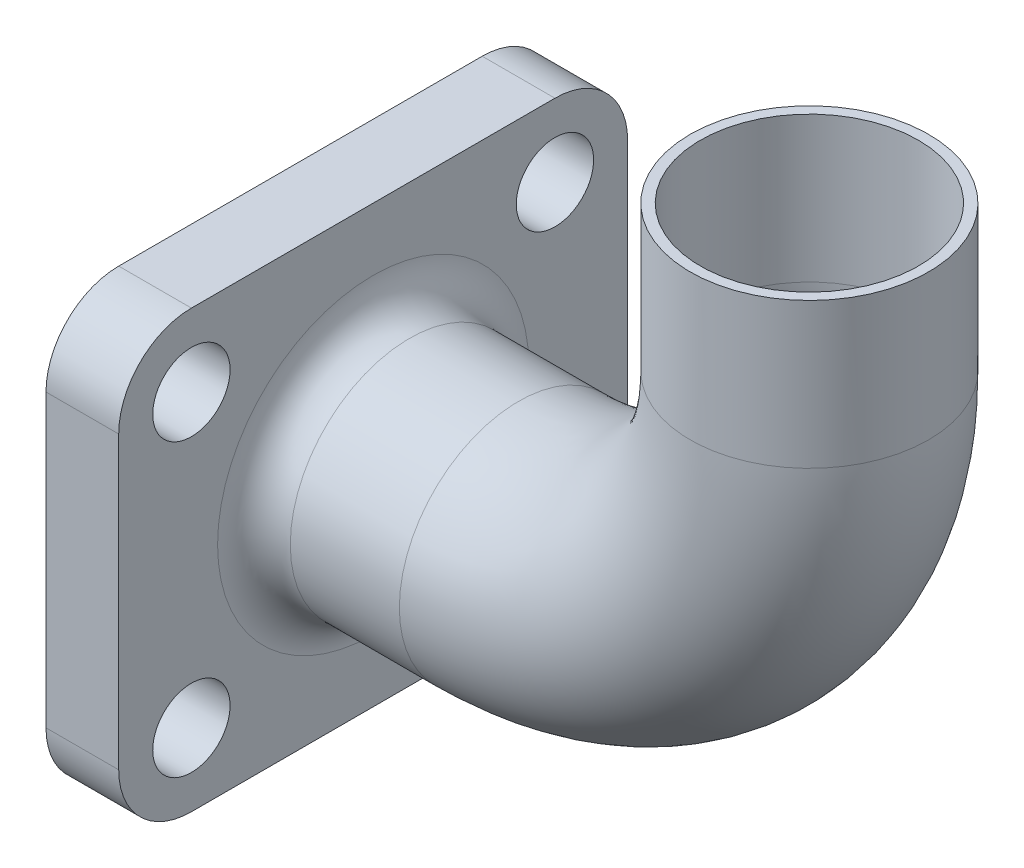
ISO-10303-21;
HEADER;
FILE_DESCRIPTION(('STEP AP214'),'2;1');
FILE_NAME('part.step','',(''),(''),'','','');
FILE_SCHEMA(('AUTOMOTIVE_DESIGN { 1 0 10303 214 1 1 1 1 }'));
ENDSEC;
DATA;
#1=APPLICATION_CONTEXT('core data for automotive mechanical design processes');
#2=APPLICATION_PROTOCOL_DEFINITION('international standard','automotive_design',2000,#1);
#3=PRODUCT_CONTEXT('',#1,'mechanical');
#4=PRODUCT('Part','Part','',(#3));
#5=PRODUCT_RELATED_PRODUCT_CATEGORY('part','',(#4));
#6=PRODUCT_DEFINITION_FORMATION('','',#4);
#7=PRODUCT_DEFINITION_CONTEXT('part definition',#1,'design');
#8=PRODUCT_DEFINITION('design','',#6,#7);
#9=PRODUCT_DEFINITION_SHAPE('','',#8);
#10=(LENGTH_UNIT() NAMED_UNIT(*) SI_UNIT(.MILLI.,.METRE.));
#11=(NAMED_UNIT(*) PLANE_ANGLE_UNIT() SI_UNIT($,.RADIAN.));
#12=(NAMED_UNIT(*) SI_UNIT($,.STERADIAN.) SOLID_ANGLE_UNIT());
#13=UNCERTAINTY_MEASURE_WITH_UNIT(LENGTH_MEASURE(1.E-05),#10,'distance_accuracy_value','');
#14=(GEOMETRIC_REPRESENTATION_CONTEXT(3) GLOBAL_UNCERTAINTY_ASSIGNED_CONTEXT((#13)) GLOBAL_UNIT_ASSIGNED_CONTEXT((#10,
#11,#12)) REPRESENTATION_CONTEXT('',''));
#15=CARTESIAN_POINT('',(0.,0.,0.));
#16=DIRECTION('',(0.,0.,1.));
#17=DIRECTION('',(1.,0.,0.));
#18=AXIS2_PLACEMENT_3D('',#15,#16,#17);
#19=CARTESIAN_POINT('',(6.35,-12.7,15.875));
#20=DIRECTION('',(-1.,0.,0.));
#21=DIRECTION('',(0.,0.,1.));
#22=AXIS2_PLACEMENT_3D('',#19,#20,#21);
#23=CYLINDRICAL_SURFACE('',#22,6.35);
#24=CARTESIAN_POINT('',(0.,-12.7,15.875));
#25=DIRECTION('',(1.,0.,0.));
#26=DIRECTION('',(0.,0.,1.));
#27=AXIS2_PLACEMENT_3D('',#24,#25,#26);
#28=CIRCLE('',#27,6.35);
#29=CARTESIAN_POINT('',(0.,-12.7,22.225));
#30=VERTEX_POINT('',#29);
#31=CARTESIAN_POINT('',(0.,-19.05,15.875));
#32=VERTEX_POINT('',#31);
#33=EDGE_CURVE('E135',#30,#32,#28,.T.);
#34=ORIENTED_EDGE('',*,*,#33,.T.);
#35=DIRECTION('',(-1.,0.,0.));
#36=VECTOR('',#35,1.);
#37=CARTESIAN_POINT('',(6.35,-19.05,15.875));
#38=LINE('',#37,#36);
#39=CARTESIAN_POINT('',(6.35,-19.05,15.875));
#40=VERTEX_POINT('',#39);
#41=EDGE_CURVE('E163',#40,#32,#38,.T.);
#42=ORIENTED_EDGE('',*,*,#41,.F.);
#43=CARTESIAN_POINT('',(6.35,-12.7,15.875));
#44=DIRECTION('',(1.,0.,0.));
#45=DIRECTION('',(0.,0.,1.));
#46=AXIS2_PLACEMENT_3D('',#43,#44,#45);
#47=CIRCLE('',#46,6.35);
#48=CARTESIAN_POINT('',(6.35,-12.7,22.225));
#49=VERTEX_POINT('',#48);
#50=EDGE_CURVE('E150',#49,#40,#47,.T.);
#51=ORIENTED_EDGE('',*,*,#50,.F.);
#52=DIRECTION('',(-1.,0.,0.));
#53=VECTOR('',#52,1.);
#54=CARTESIAN_POINT('',(6.35,-12.7,22.225));
#55=LINE('',#54,#53);
#56=EDGE_CURVE('E131',#49,#30,#55,.T.);
#57=ORIENTED_EDGE('',*,*,#56,.T.);
#58=EDGE_LOOP('',(#34,#42,#51,#57));
#59=FACE_BOUND('',#58,.T.);
#60=ADVANCED_FACE('F37',(#59),#23,.T.);
#61=CARTESIAN_POINT('',(6.35,-19.05,-15.875));
#62=DIRECTION('',(0.,1.,0.));
#63=DIRECTION('',(0.,0.,1.));
#64=AXIS2_PLACEMENT_3D('',#61,#62,#63);
#65=PLANE('',#64);
#66=DIRECTION('',(0.,0.,-1.));
#67=VECTOR('',#66,1.);
#68=CARTESIAN_POINT('',(0.,-19.05,-15.875));
#69=LINE('',#68,#67);
#70=CARTESIAN_POINT('',(0.,-19.05,-15.875));
#71=VERTEX_POINT('',#70);
#72=EDGE_CURVE('E138',#32,#71,#69,.T.);
#73=ORIENTED_EDGE('',*,*,#72,.T.);
#74=DIRECTION('',(-1.,0.,0.));
#75=VECTOR('',#74,1.);
#76=CARTESIAN_POINT('',(6.35,-19.05,-15.875));
#77=LINE('',#76,#75);
#78=CARTESIAN_POINT('',(6.35,-19.05,-15.875));
#79=VERTEX_POINT('',#78);
#80=EDGE_CURVE('E160',#79,#71,#77,.T.);
#81=ORIENTED_EDGE('',*,*,#80,.F.);
#82=DIRECTION('',(0.,0.,-1.));
#83=VECTOR('',#82,1.);
#84=CARTESIAN_POINT('',(6.35,-19.05,-15.875));
#85=LINE('',#84,#83);
#86=EDGE_CURVE('E98',#40,#79,#85,.T.);
#87=ORIENTED_EDGE('',*,*,#86,.F.);
#88=ORIENTED_EDGE('',*,*,#41,.T.);
#89=EDGE_LOOP('',(#73,#81,#87,#88));
#90=FACE_BOUND('',#89,.T.);
#91=ADVANCED_FACE('F223',(#90),#65,.F.);
#92=CARTESIAN_POINT('',(6.35,-12.7,-15.875));
#93=DIRECTION('',(-1.,0.,0.));
#94=DIRECTION('',(0.,0.,1.));
#95=AXIS2_PLACEMENT_3D('',#92,#93,#94);
#96=CYLINDRICAL_SURFACE('',#95,6.35);
#97=CARTESIAN_POINT('',(0.,-12.7,-15.875));
#98=DIRECTION('',(1.,0.,0.));
#99=DIRECTION('',(0.,0.,-1.));
#100=AXIS2_PLACEMENT_3D('',#97,#98,#99);
#101=CIRCLE('',#100,6.35);
#102=CARTESIAN_POINT('',(0.,-12.7,-22.225));
#103=VERTEX_POINT('',#102);
#104=EDGE_CURVE('E141',#71,#103,#101,.T.);
#105=ORIENTED_EDGE('',*,*,#104,.T.);
#106=DIRECTION('',(-1.,0.,0.));
#107=VECTOR('',#106,1.);
#108=CARTESIAN_POINT('',(6.35,-12.7,-22.225));
#109=LINE('',#108,#107);
#110=CARTESIAN_POINT('',(6.35,-12.7,-22.225));
#111=VERTEX_POINT('',#110);
#112=EDGE_CURVE('E157',#111,#103,#109,.T.);
#113=ORIENTED_EDGE('',*,*,#112,.F.);
#114=CARTESIAN_POINT('',(6.35,-12.7,-15.875));
#115=DIRECTION('',(1.,0.,0.));
#116=DIRECTION('',(0.,0.,-1.));
#117=AXIS2_PLACEMENT_3D('',#114,#115,#116);
#118=CIRCLE('',#117,6.35);
#119=EDGE_CURVE('E191',#79,#111,#118,.T.);
#120=ORIENTED_EDGE('',*,*,#119,.F.);
#121=ORIENTED_EDGE('',*,*,#80,.T.);
#122=EDGE_LOOP('',(#105,#113,#120,#121));
#123=FACE_BOUND('',#122,.T.);
#124=ADVANCED_FACE('F227',(#123),#96,.T.);
#125=CARTESIAN_POINT('',(6.35,-12.7,-22.225));
#126=DIRECTION('',(0.,0.,1.));
#127=DIRECTION('',(1.,0.,0.));
#128=AXIS2_PLACEMENT_3D('',#125,#126,#127);
#129=PLANE('',#128);
#130=DIRECTION('',(0.,1.,0.));
#131=VECTOR('',#130,1.);
#132=CARTESIAN_POINT('',(0.,-12.7,-22.225));
#133=LINE('',#132,#131);
#134=CARTESIAN_POINT('',(0.,12.7,-22.225));
#135=VERTEX_POINT('',#134);
#136=EDGE_CURVE('E143',#103,#135,#133,.T.);
#137=ORIENTED_EDGE('',*,*,#136,.T.);
#138=DIRECTION('',(-1.,0.,0.));
#139=VECTOR('',#138,1.);
#140=CARTESIAN_POINT('',(6.35,12.7,-22.225));
#141=LINE('',#140,#139);
#142=CARTESIAN_POINT('',(6.35,12.7,-22.225));
#143=VERTEX_POINT('',#142);
#144=EDGE_CURVE('E154',#143,#135,#141,.T.);
#145=ORIENTED_EDGE('',*,*,#144,.F.);
#146=DIRECTION('',(0.,1.,0.));
#147=VECTOR('',#146,1.);
#148=CARTESIAN_POINT('',(6.35,-12.7,-22.225));
#149=LINE('',#148,#147);
#150=EDGE_CURVE('E193',#111,#143,#149,.T.);
#151=ORIENTED_EDGE('',*,*,#150,.F.);
#152=ORIENTED_EDGE('',*,*,#112,.T.);
#153=EDGE_LOOP('',(#137,#145,#151,#152));
#154=FACE_BOUND('',#153,.T.);
#155=ADVANCED_FACE('F199',(#154),#129,.F.);
#156=CARTESIAN_POINT('',(6.35,12.7,-15.875));
#157=DIRECTION('',(-1.,0.,0.));
#158=DIRECTION('',(0.,0.,1.));
#159=AXIS2_PLACEMENT_3D('',#156,#157,#158);
#160=CYLINDRICAL_SURFACE('',#159,6.35);
#161=CARTESIAN_POINT('',(0.,12.7,-15.875));
#162=DIRECTION('',(1.,0.,0.));
#163=DIRECTION('',(0.,0.,1.));
#164=AXIS2_PLACEMENT_3D('',#161,#162,#163);
#165=CIRCLE('',#164,6.35);
#166=CARTESIAN_POINT('',(0.,19.05,-15.875));
#167=VERTEX_POINT('',#166);
#168=EDGE_CURVE('E145',#135,#167,#165,.T.);
#169=ORIENTED_EDGE('',*,*,#168,.T.);
#170=DIRECTION('',(-1.,0.,0.));
#171=VECTOR('',#170,1.);
#172=CARTESIAN_POINT('',(6.35,19.05,-15.875));
#173=LINE('',#172,#171);
#174=CARTESIAN_POINT('',(6.35,19.05,-15.875));
#175=VERTEX_POINT('',#174);
#176=EDGE_CURVE('E126',#175,#167,#173,.T.);
#177=ORIENTED_EDGE('',*,*,#176,.F.);
#178=CARTESIAN_POINT('',(6.35,12.7,-15.875));
#179=DIRECTION('',(1.,0.,0.));
#180=DIRECTION('',(0.,0.,1.));
#181=AXIS2_PLACEMENT_3D('',#178,#179,#180);
#182=CIRCLE('',#181,6.35);
#183=EDGE_CURVE('E117',#143,#175,#182,.T.);
#184=ORIENTED_EDGE('',*,*,#183,.F.);
#185=ORIENTED_EDGE('',*,*,#144,.T.);
#186=EDGE_LOOP('',(#169,#177,#184,#185));
#187=FACE_BOUND('',#186,.T.);
#188=ADVANCED_FACE('F203',(#187),#160,.T.);
#189=CARTESIAN_POINT('',(6.35,19.05,-15.875));
#190=DIRECTION('',(0.,-1.,0.));
#191=DIRECTION('',(0.,0.,-1.));
#192=AXIS2_PLACEMENT_3D('',#189,#190,#191);
#193=PLANE('',#192);
#194=DIRECTION('',(0.,0.,1.));
#195=VECTOR('',#194,1.);
#196=CARTESIAN_POINT('',(0.,19.05,-15.875));
#197=LINE('',#196,#195);
#198=CARTESIAN_POINT('',(0.,19.05,15.875));
#199=VERTEX_POINT('',#198);
#200=EDGE_CURVE('E125',#167,#199,#197,.T.);
#201=ORIENTED_EDGE('',*,*,#200,.T.);
#202=DIRECTION('',(-1.,0.,0.));
#203=VECTOR('',#202,1.);
#204=CARTESIAN_POINT('',(6.35,19.05,15.875));
#205=LINE('',#204,#203);
#206=CARTESIAN_POINT('',(6.35,19.05,15.875));
#207=VERTEX_POINT('',#206);
#208=EDGE_CURVE('E122',#207,#199,#205,.T.);
#209=ORIENTED_EDGE('',*,*,#208,.F.);
#210=DIRECTION('',(0.,0.,1.));
#211=VECTOR('',#210,1.);
#212=CARTESIAN_POINT('',(6.35,19.05,-15.875));
#213=LINE('',#212,#211);
#214=EDGE_CURVE('E111',#175,#207,#213,.T.);
#215=ORIENTED_EDGE('',*,*,#214,.F.);
#216=ORIENTED_EDGE('',*,*,#176,.T.);
#217=EDGE_LOOP('',(#201,#209,#215,#216));
#218=FACE_BOUND('',#217,.T.);
#219=ADVANCED_FACE('F123',(#218),#193,.F.);
#220=CARTESIAN_POINT('',(6.35,12.7,15.875));
#221=DIRECTION('',(-1.,0.,0.));
#222=DIRECTION('',(0.,0.,1.));
#223=AXIS2_PLACEMENT_3D('',#220,#221,#222);
#224=CYLINDRICAL_SURFACE('',#223,6.35);
#225=CARTESIAN_POINT('',(0.,12.7,15.875));
#226=DIRECTION('',(1.,0.,0.));
#227=DIRECTION('',(0.,0.,-1.));
#228=AXIS2_PLACEMENT_3D('',#225,#226,#227);
#229=CIRCLE('',#228,6.35);
#230=CARTESIAN_POINT('',(0.,12.6999999999999,22.225));
#231=VERTEX_POINT('',#230);
#232=EDGE_CURVE('E83',#199,#231,#229,.T.);
#233=ORIENTED_EDGE('',*,*,#232,.T.);
#234=DIRECTION('',(-1.,0.,0.));
#235=VECTOR('',#234,1.);
#236=CARTESIAN_POINT('',(6.35,12.6999999999999,22.225));
#237=LINE('',#236,#235);
#238=CARTESIAN_POINT('',(6.35,12.6999999999999,22.225));
#239=VERTEX_POINT('',#238);
#240=EDGE_CURVE('E127',#239,#231,#237,.T.);
#241=ORIENTED_EDGE('',*,*,#240,.F.);
#242=CARTESIAN_POINT('',(6.35,12.7,15.875));
#243=DIRECTION('',(1.,0.,0.));
#244=DIRECTION('',(0.,0.,-1.));
#245=AXIS2_PLACEMENT_3D('',#242,#243,#244);
#246=CIRCLE('',#245,6.35);
#247=EDGE_CURVE('E115',#207,#239,#246,.T.);
#248=ORIENTED_EDGE('',*,*,#247,.F.);
#249=ORIENTED_EDGE('',*,*,#208,.T.);
#250=EDGE_LOOP('',(#233,#241,#248,#249));
#251=FACE_BOUND('',#250,.T.);
#252=ADVANCED_FACE('F129',(#251),#224,.T.);
#253=CARTESIAN_POINT('',(6.35,-12.7,22.225));
#254=DIRECTION('',(0.,0.,-1.));
#255=DIRECTION('',(-1.,0.,0.));
#256=AXIS2_PLACEMENT_3D('',#253,#254,#255);
#257=PLANE('',#256);
#258=DIRECTION('',(0.,-1.,0.));
#259=VECTOR('',#258,1.);
#260=CARTESIAN_POINT('',(0.,-12.7,22.225));
#261=LINE('',#260,#259);
#262=EDGE_CURVE('E89',#231,#30,#261,.T.);
#263=ORIENTED_EDGE('',*,*,#262,.T.);
#264=ORIENTED_EDGE('',*,*,#56,.F.);
#265=DIRECTION('',(0.,-1.,0.));
#266=VECTOR('',#265,1.);
#267=CARTESIAN_POINT('',(6.35,-12.7,22.225));
#268=LINE('',#267,#266);
#269=EDGE_CURVE('E54',#239,#49,#268,.T.);
#270=ORIENTED_EDGE('',*,*,#269,.F.);
#271=ORIENTED_EDGE('',*,*,#240,.T.);
#272=EDGE_LOOP('',(#263,#264,#270,#271));
#273=FACE_BOUND('',#272,.T.);
#274=ADVANCED_FACE('F211',(#273),#257,.F.);
#275=CARTESIAN_POINT('',(6.35,-12.7,15.875));
#276=DIRECTION('',(-1.,0.,0.));
#277=DIRECTION('',(0.,0.,1.));
#278=AXIS2_PLACEMENT_3D('',#275,#276,#277);
#279=PLANE('',#278);
#280=CARTESIAN_POINT('',(6.35,0.,0.));
#281=DIRECTION('',(-1.,0.,0.));
#282=DIRECTION('',(0.,0.,1.));
#283=AXIS2_PLACEMENT_3D('',#280,#281,#282);
#284=CIRCLE('',#283,13.589);
#285=CARTESIAN_POINT('',(6.35,0.,13.589));
#286=VERTEX_POINT('',#285);
#287=EDGE_CURVE('E11',#286,#286,#284,.T.);
#288=ORIENTED_EDGE('',*,*,#287,.T.);
#289=EDGE_LOOP('',(#288));
#290=FACE_BOUND('',#289,.T.);
#291=CARTESIAN_POINT('',(6.35,-12.7,15.875));
#292=DIRECTION('',(1.,0.,0.));
#293=DIRECTION('',(0.,0.,1.));
#294=AXIS2_PLACEMENT_3D('',#291,#292,#293);
#295=CIRCLE('',#294,3.3782);
#296=CARTESIAN_POINT('',(6.35,-12.7,19.2532));
#297=VERTEX_POINT('',#296);
#298=EDGE_CURVE('E412',#297,#297,#295,.T.);
#299=ORIENTED_EDGE('',*,*,#298,.F.);
#300=EDGE_LOOP('',(#299));
#301=FACE_BOUND('',#300,.T.);
#302=CARTESIAN_POINT('',(6.35,-12.7000000000001,-15.875));
#303=DIRECTION('',(1.,0.,0.));
#304=DIRECTION('',(0.,0.,-1.));
#305=AXIS2_PLACEMENT_3D('',#302,#303,#304);
#306=CIRCLE('',#305,3.3782);
#307=CARTESIAN_POINT('',(6.35,-12.7000000000001,-19.2532));
#308=VERTEX_POINT('',#307);
#309=EDGE_CURVE('E416',#308,#308,#306,.T.);
#310=ORIENTED_EDGE('',*,*,#309,.F.);
#311=EDGE_LOOP('',(#310));
#312=FACE_BOUND('',#311,.T.);
#313=CARTESIAN_POINT('',(6.35,12.7,-15.875));
#314=DIRECTION('',(1.,0.,0.));
#315=DIRECTION('',(0.,0.,1.));
#316=AXIS2_PLACEMENT_3D('',#313,#314,#315);
#317=CIRCLE('',#316,3.3782);
#318=CARTESIAN_POINT('',(6.35,12.7,-12.4968));
#319=VERTEX_POINT('',#318);
#320=EDGE_CURVE('E420',#319,#319,#317,.T.);
#321=ORIENTED_EDGE('',*,*,#320,.F.);
#322=EDGE_LOOP('',(#321));
#323=FACE_BOUND('',#322,.T.);
#324=CARTESIAN_POINT('',(6.35,12.7,15.875));
#325=DIRECTION('',(1.,0.,0.));
#326=DIRECTION('',(0.,0.,-1.));
#327=AXIS2_PLACEMENT_3D('',#324,#325,#326);
#328=CIRCLE('',#327,3.3782);
#329=CARTESIAN_POINT('',(6.35,12.7,12.4968));
#330=VERTEX_POINT('',#329);
#331=EDGE_CURVE('E170',#330,#330,#328,.T.);
#332=ORIENTED_EDGE('',*,*,#331,.F.);
#333=EDGE_LOOP('',(#332));
#334=FACE_BOUND('',#333,.T.);
#335=ORIENTED_EDGE('',*,*,#50,.T.);
#336=ORIENTED_EDGE('',*,*,#86,.T.);
#337=ORIENTED_EDGE('',*,*,#119,.T.);
#338=ORIENTED_EDGE('',*,*,#150,.T.);
#339=ORIENTED_EDGE('',*,*,#183,.T.);
#340=ORIENTED_EDGE('',*,*,#214,.T.);
#341=ORIENTED_EDGE('',*,*,#247,.T.);
#342=ORIENTED_EDGE('',*,*,#269,.T.);
#343=EDGE_LOOP('',(#335,#336,#337,#338,#339,#340,#341,#342));
#344=FACE_BOUND('',#343,.T.);
#345=ADVANCED_FACE('F113',(#290,#301,#312,#323,#334,#344),#279,.F.);
#346=CARTESIAN_POINT('',(0.,-12.7,15.875));
#347=DIRECTION('',(-1.,0.,0.));
#348=DIRECTION('',(0.,0.,1.));
#349=AXIS2_PLACEMENT_3D('',#346,#347,#348);
#350=PLANE('',#349);
#351=CARTESIAN_POINT('',(0.,-12.7,15.875));
#352=DIRECTION('',(-1.,0.,0.));
#353=DIRECTION('',(0.,0.,1.));
#354=AXIS2_PLACEMENT_3D('',#351,#352,#353);
#355=CIRCLE('',#354,3.3782);
#356=CARTESIAN_POINT('',(0.,-12.7,19.2532));
#357=VERTEX_POINT('',#356);
#358=EDGE_CURVE('E176',#357,#357,#355,.T.);
#359=ORIENTED_EDGE('',*,*,#358,.F.);
#360=EDGE_LOOP('',(#359));
#361=FACE_BOUND('',#360,.T.);
#362=CARTESIAN_POINT('',(0.,-12.7000000000001,-15.875));
#363=DIRECTION('',(-1.,0.,0.));
#364=DIRECTION('',(0.,0.,1.));
#365=AXIS2_PLACEMENT_3D('',#362,#363,#364);
#366=CIRCLE('',#365,3.3782);
#367=CARTESIAN_POINT('',(0.,-12.7000000000001,-12.4968));
#368=VERTEX_POINT('',#367);
#369=EDGE_CURVE('E173',#368,#368,#366,.T.);
#370=ORIENTED_EDGE('',*,*,#369,.F.);
#371=EDGE_LOOP('',(#370));
#372=FACE_BOUND('',#371,.T.);
#373=CARTESIAN_POINT('',(0.,12.7,-15.875));
#374=DIRECTION('',(-1.,0.,0.));
#375=DIRECTION('',(0.,0.,1.));
#376=AXIS2_PLACEMENT_3D('',#373,#374,#375);
#377=CIRCLE('',#376,3.3782);
#378=CARTESIAN_POINT('',(0.,12.7,-12.4968));
#379=VERTEX_POINT('',#378);
#380=EDGE_CURVE('E169',#379,#379,#377,.T.);
#381=ORIENTED_EDGE('',*,*,#380,.F.);
#382=EDGE_LOOP('',(#381));
#383=FACE_BOUND('',#382,.T.);
#384=CARTESIAN_POINT('',(0.,12.7,15.875));
#385=DIRECTION('',(-1.,0.,0.));
#386=DIRECTION('',(0.,0.,1.));
#387=AXIS2_PLACEMENT_3D('',#384,#385,#386);
#388=CIRCLE('',#387,3.3782);
#389=CARTESIAN_POINT('',(0.,12.7,19.2532));
#390=VERTEX_POINT('',#389);
#391=EDGE_CURVE('E166',#390,#390,#388,.T.);
#392=ORIENTED_EDGE('',*,*,#391,.F.);
#393=EDGE_LOOP('',(#392));
#394=FACE_BOUND('',#393,.T.);
#395=CARTESIAN_POINT('',(0.,0.,0.));
#396=DIRECTION('',(-1.,0.,0.));
#397=DIRECTION('',(0.,0.,1.));
#398=AXIS2_PLACEMENT_3D('',#395,#396,#397);
#399=CIRCLE('',#398,12.7);
#400=CARTESIAN_POINT('',(0.,0.,12.7));
#401=VERTEX_POINT('',#400);
#402=EDGE_CURVE('E165',#401,#401,#399,.T.);
#403=ORIENTED_EDGE('',*,*,#402,.F.);
#404=EDGE_LOOP('',(#403));
#405=FACE_BOUND('',#404,.T.);
#406=ORIENTED_EDGE('',*,*,#33,.F.);
#407=ORIENTED_EDGE('',*,*,#262,.F.);
#408=ORIENTED_EDGE('',*,*,#232,.F.);
#409=ORIENTED_EDGE('',*,*,#200,.F.);
#410=ORIENTED_EDGE('',*,*,#168,.F.);
#411=ORIENTED_EDGE('',*,*,#136,.F.);
#412=ORIENTED_EDGE('',*,*,#104,.F.);
#413=ORIENTED_EDGE('',*,*,#72,.F.);
#414=EDGE_LOOP('',(#406,#407,#408,#409,#410,#411,#412,#413));
#415=FACE_BOUND('',#414,.T.);
#416=ADVANCED_FACE('F206',(#361,#372,#383,#394,#405,#415),#350,.T.);
#417=CARTESIAN_POINT('',(-2.921,0.,0.));
#418=DIRECTION('',(1.,0.,0.));
#419=DIRECTION('',(0.,0.,-1.));
#420=AXIS2_PLACEMENT_3D('',#417,#418,#419);
#421=CYLINDRICAL_SURFACE('',#420,12.7);
#422=CARTESIAN_POINT('',(-2.921,0.,0.));
#423=DIRECTION('',(-1.,0.,0.));
#424=DIRECTION('',(0.,0.,1.));
#425=AXIS2_PLACEMENT_3D('',#422,#423,#424);
#426=CIRCLE('',#425,12.7);
#427=CARTESIAN_POINT('',(-2.921,0.,12.7));
#428=VERTEX_POINT('',#427);
#429=EDGE_CURVE('E139',#428,#428,#426,.T.);
#430=ORIENTED_EDGE('',*,*,#429,.F.);
#431=EDGE_LOOP('',(#430));
#432=FACE_BOUND('',#431,.T.);
#433=ORIENTED_EDGE('',*,*,#402,.T.);
#434=EDGE_LOOP('',(#433));
#435=FACE_BOUND('',#434,.T.);
#436=ADVANCED_FACE('F256',(#432,#435),#421,.T.);
#437=CARTESIAN_POINT('',(-2.921,0.,0.));
#438=DIRECTION('',(-1.,0.,0.));
#439=DIRECTION('',(0.,0.,1.));
#440=AXIS2_PLACEMENT_3D('',#437,#438,#439);
#441=PLANE('',#440);
#442=CARTESIAN_POINT('',(-2.921,0.,0.));
#443=DIRECTION('',(-1.,0.,0.));
#444=DIRECTION('',(0.,0.,1.));
#445=AXIS2_PLACEMENT_3D('',#442,#443,#444);
#446=CIRCLE('',#445,9.525);
#447=CARTESIAN_POINT('',(-2.921,0.,9.525));
#448=VERTEX_POINT('',#447);
#449=EDGE_CURVE('E178',#448,#448,#446,.T.);
#450=ORIENTED_EDGE('',*,*,#449,.F.);
#451=EDGE_LOOP('',(#450));
#452=FACE_BOUND('',#451,.T.);
#453=ORIENTED_EDGE('',*,*,#429,.T.);
#454=EDGE_LOOP('',(#453));
#455=FACE_BOUND('',#454,.T.);
#456=ADVANCED_FACE('F261',(#452,#455),#441,.T.);
#457=CARTESIAN_POINT('',(44.45,38.1,0.));
#458=DIRECTION('',(0.,1.,0.));
#459=DIRECTION('',(0.,0.,-1.));
#460=AXIS2_PLACEMENT_3D('',#457,#458,#459);
#461=PLANE('',#460);
#462=CARTESIAN_POINT('',(44.45,38.1,0.));
#463=DIRECTION('',(0.,1.,0.));
#464=DIRECTION('',(0.,0.,-1.));
#465=AXIS2_PLACEMENT_3D('',#462,#463,#464);
#466=CIRCLE('',#465,9.525);
#467=CARTESIAN_POINT('',(44.45,38.1,-9.525));
#468=VERTEX_POINT('',#467);
#469=EDGE_CURVE('E437',#468,#468,#466,.T.);
#470=ORIENTED_EDGE('',*,*,#469,.F.);
#471=EDGE_LOOP('',(#470));
#472=FACE_BOUND('',#471,.T.);
#473=CARTESIAN_POINT('',(44.45,38.1,0.));
#474=DIRECTION('',(0.,1.,0.));
#475=DIRECTION('',(-1.,0.,0.));
#476=AXIS2_PLACEMENT_3D('',#473,#474,#475);
#477=CIRCLE('',#476,10.414);
#478=CARTESIAN_POINT('',(34.036,38.1,0.));
#479=VERTEX_POINT('',#478);
#480=EDGE_CURVE('E445',#479,#479,#477,.T.);
#481=ORIENTED_EDGE('',*,*,#480,.T.);
#482=EDGE_LOOP('',(#481));
#483=FACE_BOUND('',#482,.T.);
#484=ADVANCED_FACE('F271',(#472,#483),#461,.T.);
#485=CARTESIAN_POINT('',(6.35,0.,0.));
#486=DIRECTION('',(1.,0.,0.));
#487=DIRECTION('',(0.,1.,0.));
#488=AXIS2_PLACEMENT_3D('',#485,#486,#487);
#489=CYLINDRICAL_SURFACE('',#488,10.414);
#490=CARTESIAN_POINT('',(9.525,0.,0.));
#491=DIRECTION('',(-1.,0.,0.));
#492=DIRECTION('',(0.,0.,1.));
#493=AXIS2_PLACEMENT_3D('',#490,#491,#492);
#494=CIRCLE('',#493,10.414);
#495=CARTESIAN_POINT('',(9.525,0.,10.414));
#496=VERTEX_POINT('',#495);
#497=EDGE_CURVE('E46',#496,#496,#494,.F.);
#498=ORIENTED_EDGE('',*,*,#497,.T.);
#499=EDGE_LOOP('',(#498));
#500=FACE_BOUND('',#499,.T.);
#501=CARTESIAN_POINT('',(19.05,0.,0.));
#502=DIRECTION('',(-1.,0.,0.));
#503=DIRECTION('',(0.,-1.,0.));
#504=AXIS2_PLACEMENT_3D('',#501,#502,#503);
#505=CIRCLE('',#504,10.414);
#506=CARTESIAN_POINT('',(19.05,-10.414,0.));
#507=VERTEX_POINT('',#506);
#508=EDGE_CURVE('E440',#507,#507,#505,.F.);
#509=ORIENTED_EDGE('',*,*,#508,.F.);
#510=EDGE_LOOP('',(#509));
#511=FACE_BOUND('',#510,.T.);
#512=ADVANCED_FACE('F276',(#500,#511),#489,.T.);
#513=CARTESIAN_POINT('',(19.05,25.4,0.));
#514=DIRECTION('',(0.,0.,1.));
#515=DIRECTION('',(1.,0.,0.));
#516=AXIS2_PLACEMENT_3D('',#513,#514,#515);
#517=TOROIDAL_SURFACE('',#516,25.4,10.414);
#518=CARTESIAN_POINT('',(44.45,25.4,0.));
#519=DIRECTION('',(0.,1.,0.));
#520=DIRECTION('',(-1.,0.,0.));
#521=AXIS2_PLACEMENT_3D('',#518,#519,#520);
#522=CIRCLE('',#521,10.414);
#523=CARTESIAN_POINT('',(54.864,25.4,0.));
#524=VERTEX_POINT('',#523);
#525=EDGE_CURVE('E443',#524,#524,#522,.T.);
#526=CARTESIAN_POINT('',(19.05,25.4,0.));
#527=DIRECTION('',(0.,0.,1.));
#528=DIRECTION('',(1.,0.,0.));
#529=AXIS2_PLACEMENT_3D('',#526,#527,#528);
#530=CIRCLE('',#529,35.814);
#531=EDGE_CURVE('',#507,#524,#530,.T.);
#532=ORIENTED_EDGE('',*,*,#508,.T.);
#533=ORIENTED_EDGE('',*,*,#525,.F.);
#534=ORIENTED_EDGE('',*,*,#531,.T.);
#535=ORIENTED_EDGE('',*,*,#531,.F.);
#536=EDGE_LOOP('',(#532,#534,#533,#535));
#537=FACE_BOUND('',#536,.T.);
#538=ADVANCED_FACE('F285',(#537),#517,.T.);
#539=CARTESIAN_POINT('',(44.45,25.4,0.));
#540=DIRECTION('',(0.,1.,0.));
#541=DIRECTION('',(-1.,0.,0.));
#542=AXIS2_PLACEMENT_3D('',#539,#540,#541);
#543=CYLINDRICAL_SURFACE('',#542,10.414);
#544=ORIENTED_EDGE('',*,*,#480,.F.);
#545=EDGE_LOOP('',(#544));
#546=FACE_BOUND('',#545,.T.);
#547=ORIENTED_EDGE('',*,*,#525,.T.);
#548=EDGE_LOOP('',(#547));
#549=FACE_BOUND('',#548,.T.);
#550=ADVANCED_FACE('F290',(#546,#549),#543,.T.);
#551=CARTESIAN_POINT('',(6.35,0.,0.));
#552=DIRECTION('',(1.,0.,0.));
#553=DIRECTION('',(0.,1.,0.));
#554=AXIS2_PLACEMENT_3D('',#551,#552,#553);
#555=CYLINDRICAL_SURFACE('',#554,9.525);
#556=CARTESIAN_POINT('',(19.05,0.,0.));
#557=DIRECTION('',(1.,0.,0.));
#558=DIRECTION('',(0.,0.,-1.));
#559=AXIS2_PLACEMENT_3D('',#556,#557,#558);
#560=CIRCLE('',#559,9.525);
#561=CARTESIAN_POINT('',(19.05,-9.525,0.));
#562=VERTEX_POINT('',#561);
#563=EDGE_CURVE('E431',#562,#562,#560,.T.);
#564=ORIENTED_EDGE('',*,*,#563,.T.);
#565=EDGE_LOOP('',(#564));
#566=FACE_BOUND('',#565,.T.);
#567=ORIENTED_EDGE('',*,*,#449,.T.);
#568=EDGE_LOOP('',(#567));
#569=FACE_BOUND('',#568,.T.);
#570=ADVANCED_FACE('F300',(#566,#569),#555,.F.);
#571=CARTESIAN_POINT('',(19.05,25.4,0.));
#572=DIRECTION('',(0.,0.,1.));
#573=DIRECTION('',(1.,0.,0.));
#574=AXIS2_PLACEMENT_3D('',#571,#572,#573);
#575=TOROIDAL_SURFACE('',#574,25.4,9.525);
#576=CARTESIAN_POINT('',(44.45,25.4,0.));
#577=DIRECTION('',(0.,1.,0.));
#578=DIRECTION('',(0.,0.,-1.));
#579=AXIS2_PLACEMENT_3D('',#576,#577,#578);
#580=CIRCLE('',#579,9.525);
#581=CARTESIAN_POINT('',(53.975,25.4,0.));
#582=VERTEX_POINT('',#581);
#583=EDGE_CURVE('E434',#582,#582,#580,.T.);
#584=CARTESIAN_POINT('',(19.05,25.4,0.));
#585=DIRECTION('',(0.,0.,1.));
#586=DIRECTION('',(1.,0.,0.));
#587=AXIS2_PLACEMENT_3D('',#584,#585,#586);
#588=CIRCLE('',#587,34.925);
#589=EDGE_CURVE('',#562,#582,#588,.T.);
#590=ORIENTED_EDGE('',*,*,#563,.F.);
#591=ORIENTED_EDGE('',*,*,#583,.T.);
#592=ORIENTED_EDGE('',*,*,#589,.T.);
#593=ORIENTED_EDGE('',*,*,#589,.F.);
#594=EDGE_LOOP('',(#590,#592,#591,#593));
#595=FACE_BOUND('',#594,.T.);
#596=ADVANCED_FACE('F308',(#595),#575,.F.);
#597=CARTESIAN_POINT('',(44.45,25.4,0.));
#598=DIRECTION('',(0.,1.,0.));
#599=DIRECTION('',(-1.,0.,0.));
#600=AXIS2_PLACEMENT_3D('',#597,#598,#599);
#601=CYLINDRICAL_SURFACE('',#600,9.525);
#602=ORIENTED_EDGE('',*,*,#469,.T.);
#603=EDGE_LOOP('',(#602));
#604=FACE_BOUND('',#603,.T.);
#605=ORIENTED_EDGE('',*,*,#583,.F.);
#606=EDGE_LOOP('',(#605));
#607=FACE_BOUND('',#606,.T.);
#608=ADVANCED_FACE('F279',(#604,#607),#601,.F.);
#609=CARTESIAN_POINT('',(-2.921,12.7,15.875));
#610=DIRECTION('',(1.,0.,0.));
#611=DIRECTION('',(0.,0.,-1.));
#612=AXIS2_PLACEMENT_3D('',#609,#610,#611);
#613=CYLINDRICAL_SURFACE('',#612,3.3782);
#614=ORIENTED_EDGE('',*,*,#391,.T.);
#615=EDGE_LOOP('',(#614));
#616=FACE_BOUND('',#615,.T.);
#617=ORIENTED_EDGE('',*,*,#331,.T.);
#618=EDGE_LOOP('',(#617));
#619=FACE_BOUND('',#618,.T.);
#620=ADVANCED_FACE('F322',(#616,#619),#613,.F.);
#621=CARTESIAN_POINT('',(-2.921,12.7,-15.875));
#622=DIRECTION('',(1.,0.,0.));
#623=DIRECTION('',(0.,0.,-1.));
#624=AXIS2_PLACEMENT_3D('',#621,#622,#623);
#625=CYLINDRICAL_SURFACE('',#624,3.3782);
#626=ORIENTED_EDGE('',*,*,#380,.T.);
#627=EDGE_LOOP('',(#626));
#628=FACE_BOUND('',#627,.T.);
#629=ORIENTED_EDGE('',*,*,#320,.T.);
#630=EDGE_LOOP('',(#629));
#631=FACE_BOUND('',#630,.T.);
#632=ADVANCED_FACE('F353',(#628,#631),#625,.F.);
#633=CARTESIAN_POINT('',(-2.921,-12.7000000000001,-15.875));
#634=DIRECTION('',(1.,0.,0.));
#635=DIRECTION('',(0.,0.,-1.));
#636=AXIS2_PLACEMENT_3D('',#633,#634,#635);
#637=CYLINDRICAL_SURFACE('',#636,3.3782);
#638=ORIENTED_EDGE('',*,*,#369,.T.);
#639=EDGE_LOOP('',(#638));
#640=FACE_BOUND('',#639,.T.);
#641=ORIENTED_EDGE('',*,*,#309,.T.);
#642=EDGE_LOOP('',(#641));
#643=FACE_BOUND('',#642,.T.);
#644=ADVANCED_FACE('F363',(#640,#643),#637,.F.);
#645=CARTESIAN_POINT('',(-2.921,-12.7,15.875));
#646=DIRECTION('',(1.,0.,0.));
#647=DIRECTION('',(0.,0.,-1.));
#648=AXIS2_PLACEMENT_3D('',#645,#646,#647);
#649=CYLINDRICAL_SURFACE('',#648,3.3782);
#650=ORIENTED_EDGE('',*,*,#358,.T.);
#651=EDGE_LOOP('',(#650));
#652=FACE_BOUND('',#651,.T.);
#653=ORIENTED_EDGE('',*,*,#298,.T.);
#654=EDGE_LOOP('',(#653));
#655=FACE_BOUND('',#654,.T.);
#656=ADVANCED_FACE('F373',(#652,#655),#649,.F.);
#657=CARTESIAN_POINT('',(9.525,0.,0.));
#658=DIRECTION('',(-1.,0.,0.));
#659=DIRECTION('',(0.,0.,1.));
#660=AXIS2_PLACEMENT_3D('',#657,#658,#659);
#661=TOROIDAL_SURFACE('',#660,13.589,3.175);
#662=ORIENTED_EDGE('',*,*,#287,.F.);
#663=EDGE_LOOP('',(#662));
#664=FACE_BOUND('',#663,.T.);
#665=ORIENTED_EDGE('',*,*,#497,.F.);
#666=EDGE_LOOP('',(#665));
#667=FACE_BOUND('',#666,.T.);
#668=ADVANCED_FACE('F39',(#664,#667),#661,.F.);
#669=CLOSED_SHELL('',(#60,#91,#124,#155,#188,#219,#252,#274,#345,#416,#436,#456,#484,#512,#538,
#550,#570,#596,#608,#620,#632,#644,#656,#668));
#670=MANIFOLD_SOLID_BREP('B2',#669);
#671=ADVANCED_BREP_SHAPE_REPRESENTATION('',(#18,#670),#14);
#672=SHAPE_DEFINITION_REPRESENTATION(#9,#671);
ENDSEC;
END-ISO-10303-21;
